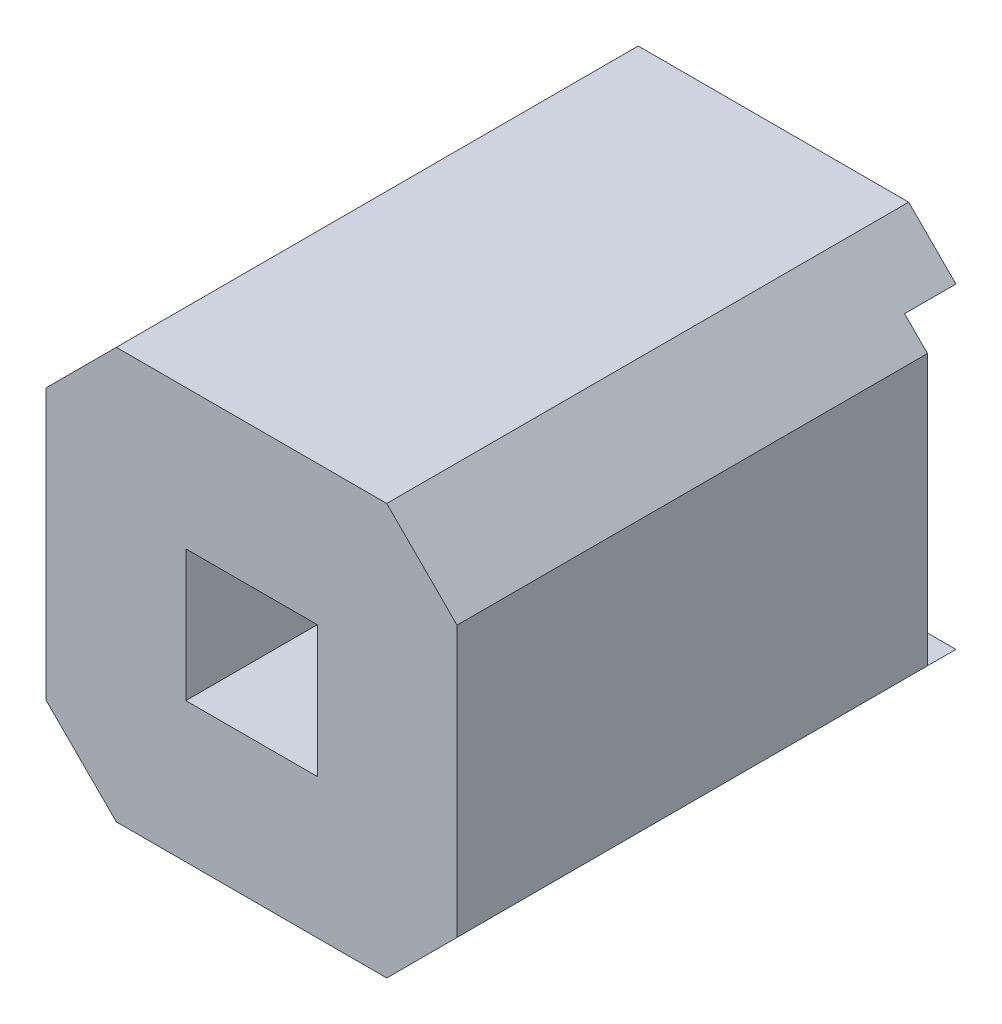
ISO-10303-21;
HEADER;
FILE_DESCRIPTION(('STEP AP214'),'2;1');
FILE_NAME('part.step','',(''),(''),'','','');
FILE_SCHEMA(('AUTOMOTIVE_DESIGN { 1 0 10303 214 1 1 1 1 }'));
ENDSEC;
DATA;
#1=APPLICATION_CONTEXT('core data for automotive mechanical design processes');
#2=APPLICATION_PROTOCOL_DEFINITION('international standard','automotive_design',2000,#1);
#3=PRODUCT_CONTEXT('',#1,'mechanical');
#4=PRODUCT('Part','Part','',(#3));
#5=PRODUCT_RELATED_PRODUCT_CATEGORY('part','',(#4));
#6=PRODUCT_DEFINITION_FORMATION('','',#4);
#7=PRODUCT_DEFINITION_CONTEXT('part definition',#1,'design');
#8=PRODUCT_DEFINITION('design','',#6,#7);
#9=PRODUCT_DEFINITION_SHAPE('','',#8);
#10=(LENGTH_UNIT() NAMED_UNIT(*) SI_UNIT(.MILLI.,.METRE.));
#11=(NAMED_UNIT(*) PLANE_ANGLE_UNIT() SI_UNIT($,.RADIAN.));
#12=(NAMED_UNIT(*) SI_UNIT($,.STERADIAN.) SOLID_ANGLE_UNIT());
#13=UNCERTAINTY_MEASURE_WITH_UNIT(LENGTH_MEASURE(1.E-05),#10,'distance_accuracy_value','');
#14=(GEOMETRIC_REPRESENTATION_CONTEXT(3) GLOBAL_UNCERTAINTY_ASSIGNED_CONTEXT((#13)) GLOBAL_UNIT_ASSIGNED_CONTEXT((#10,
#11,#12)) REPRESENTATION_CONTEXT('',''));
#15=CARTESIAN_POINT('',(0.,0.,0.));
#16=DIRECTION('',(0.,0.,1.));
#17=DIRECTION('',(1.,0.,0.));
#18=AXIS2_PLACEMENT_3D('',#15,#16,#17);
#19=CARTESIAN_POINT('',(41.58,36.22100192089,2.05));
#20=DIRECTION('',(0.,-0.707106781186498,-0.707106781186598));
#21=DIRECTION('',(0.,-0.707106781186598,0.707106781186498));
#22=AXIS2_PLACEMENT_3D('',#19,#20,#21);
#23=PLANE('',#22);
#24=DIRECTION('',(1.,1.19216795888047E-11,0.));
#25=VECTOR('',#24,1.);
#26=CARTESIAN_POINT('',(41.48000000001,36.3210019209,1.95000000001));
#27=LINE('',#26,#25);
#28=CARTESIAN_POINT('',(41.48,36.32100192089,1.95));
#29=VERTEX_POINT('',#28);
#30=CARTESIAN_POINT('',(42.32,36.32100192089,1.95));
#31=VERTEX_POINT('',#30);
#32=EDGE_CURVE('E297',#29,#31,#27,.T.);
#33=ORIENTED_EDGE('',*,*,#32,.T.);
#34=DIRECTION('',(0.577350269189626,0.577350269189626,-0.577350269189626));
#35=VECTOR('',#34,1.);
#36=CARTESIAN_POINT('',(42.22000000001,36.2210019209,2.05000000001));
#37=LINE('',#36,#35);
#38=CARTESIAN_POINT('',(42.22,36.22100192089,2.05));
#39=VERTEX_POINT('',#38);
#40=EDGE_CURVE('E317',#39,#31,#37,.T.);
#41=ORIENTED_EDGE('',*,*,#40,.F.);
#42=DIRECTION('',(-1.,-1.56361022300019E-11,0.));
#43=VECTOR('',#42,1.);
#44=CARTESIAN_POINT('',(42.22000000001,36.2210019209,2.05000000001));
#45=LINE('',#44,#43);
#46=CARTESIAN_POINT('',(41.58,36.22100192089,2.05));
#47=VERTEX_POINT('',#46);
#48=EDGE_CURVE('E343',#39,#47,#45,.T.);
#49=ORIENTED_EDGE('',*,*,#48,.T.);
#50=DIRECTION('',(0.577350269189626,-0.577350269189626,0.577350269189626));
#51=VECTOR('',#50,1.);
#52=CARTESIAN_POINT('',(41.48000000001,36.3210019209,1.95000000001));
#53=LINE('',#52,#51);
#54=EDGE_CURVE('E11',#29,#47,#53,.T.);
#55=ORIENTED_EDGE('',*,*,#54,.F.);
#56=EDGE_LOOP('',(#33,#41,#49,#55));
#57=FACE_BOUND('',#56,.T.);
#58=ADVANCED_FACE('F17',(#57),#23,.T.);
#59=CARTESIAN_POINT('',(41.58,35.58100192089,2.05));
#60=DIRECTION('',(0.707106781186498,0.,-0.707106781186598));
#61=DIRECTION('',(0.,-1.,0.));
#62=AXIS2_PLACEMENT_3D('',#59,#60,#61);
#63=PLANE('',#62);
#64=DIRECTION('',(0.,1.,0.));
#65=VECTOR('',#64,1.);
#66=CARTESIAN_POINT('',(41.48000000001,35.4810019209,1.95000000001));
#67=LINE('',#66,#65);
#68=CARTESIAN_POINT('',(41.48,35.48100192089,1.95));
#69=VERTEX_POINT('',#68);
#70=EDGE_CURVE('E303',#69,#29,#67,.T.);
#71=ORIENTED_EDGE('',*,*,#70,.T.);
#72=ORIENTED_EDGE('',*,*,#54,.T.);
#73=DIRECTION('',(0.,-1.,0.));
#74=VECTOR('',#73,1.);
#75=CARTESIAN_POINT('',(41.58000000001,36.2210019209,2.05000000001));
#76=LINE('',#75,#74);
#77=CARTESIAN_POINT('',(41.58,35.58100192089,2.05));
#78=VERTEX_POINT('',#77);
#79=EDGE_CURVE('E355',#47,#78,#76,.T.);
#80=ORIENTED_EDGE('',*,*,#79,.T.);
#81=DIRECTION('',(0.577350269189626,0.577350269189626,0.577350269189626));
#82=VECTOR('',#81,1.);
#83=CARTESIAN_POINT('',(41.48000000001,35.4810019209,1.95000000001));
#84=LINE('',#83,#82);
#85=EDGE_CURVE('E269',#69,#78,#84,.T.);
#86=ORIENTED_EDGE('',*,*,#85,.F.);
#87=EDGE_LOOP('',(#71,#72,#80,#86));
#88=FACE_BOUND('',#87,.T.);
#89=ADVANCED_FACE('F448',(#88),#63,.T.);
#90=CARTESIAN_POINT('',(40.63,34.90100192089,1.7));
#91=DIRECTION('',(0.,1.,0.));
#92=DIRECTION('',(1.,0.,0.));
#93=AXIS2_PLACEMENT_3D('',#90,#91,#92);
#94=PLANE('',#93);
#95=DIRECTION('',(0.,0.,1.));
#96=VECTOR('',#95,1.);
#97=CARTESIAN_POINT('',(41.24183766185,34.9010019209,1.70000000001));
#98=LINE('',#97,#96);
#99=CARTESIAN_POINT('',(41.24183766184,34.90100192089,1.7));
#100=VERTEX_POINT('',#99);
#101=CARTESIAN_POINT('',(41.24183766184,34.90100192089,4.24));
#102=VERTEX_POINT('',#101);
#103=EDGE_CURVE('E27',#100,#102,#98,.T.);
#104=ORIENTED_EDGE('',*,*,#103,.F.);
#105=DIRECTION('',(1.,0.,0.));
#106=VECTOR('',#105,1.);
#107=CARTESIAN_POINT('',(41.24183766185,34.9010019209,1.70000000001));
#108=LINE('',#107,#106);
#109=CARTESIAN_POINT('',(42.55816233816,34.90100192089,1.7));
#110=VERTEX_POINT('',#109);
#111=EDGE_CURVE('E156',#100,#110,#108,.T.);
#112=ORIENTED_EDGE('',*,*,#111,.T.);
#113=DIRECTION('',(0.,0.,-1.));
#114=VECTOR('',#113,1.);
#115=CARTESIAN_POINT('',(42.55816233817,34.9010019209,4.24000000001));
#116=LINE('',#115,#114);
#117=CARTESIAN_POINT('',(42.55816233816,34.90100192089,4.24));
#118=VERTEX_POINT('',#117);
#119=EDGE_CURVE('E171',#118,#110,#116,.T.);
#120=ORIENTED_EDGE('',*,*,#119,.F.);
#121=DIRECTION('',(-1.,0.,0.));
#122=VECTOR('',#121,1.);
#123=CARTESIAN_POINT('',(42.55816233817,34.9010019209,4.24000000001));
#124=LINE('',#123,#122);
#125=EDGE_CURVE('E244',#118,#102,#124,.T.);
#126=ORIENTED_EDGE('',*,*,#125,.T.);
#127=EDGE_LOOP('',(#104,#112,#120,#126));
#128=FACE_BOUND('',#127,.T.);
#129=ADVANCED_FACE('F454',(#128),#94,.F.);
#130=CARTESIAN_POINT('',(40.82091883092,35.32192075181,1.7));
#131=DIRECTION('',(0.707106781186548,0.707106781186548,0.));
#132=DIRECTION('',(0.,0.,-1.));
#133=AXIS2_PLACEMENT_3D('',#130,#131,#132);
#134=PLANE('',#133);
#135=ORIENTED_EDGE('',*,*,#103,.T.);
#136=DIRECTION('',(0.707106781186498,-0.707106781186598,0.));
#137=VECTOR('',#136,1.);
#138=CARTESIAN_POINT('',(40.90000000001,35.24283958274,4.24000000001));
#139=LINE('',#138,#137);
#140=CARTESIAN_POINT('',(40.9,35.24283958273,4.24));
#141=VERTEX_POINT('',#140);
#142=EDGE_CURVE('E250',#141,#102,#139,.T.);
#143=ORIENTED_EDGE('',*,*,#142,.F.);
#144=DIRECTION('',(0.,0.,-1.));
#145=VECTOR('',#144,1.);
#146=CARTESIAN_POINT('',(40.90000000001,35.24283958274,4.24000000001));
#147=LINE('',#146,#145);
#148=CARTESIAN_POINT('',(40.9,35.24283958273,1.95));
#149=VERTEX_POINT('',#148);
#150=EDGE_CURVE('E432',#141,#149,#147,.T.);
#151=ORIENTED_EDGE('',*,*,#150,.T.);
#152=DIRECTION('',(-0.707106781186398,0.707106781186698,0.));
#153=VECTOR('',#152,1.);
#154=CARTESIAN_POINT('',(41.01183766185,35.1310019209,1.95000000001));
#155=LINE('',#154,#153);
#156=CARTESIAN_POINT('',(41.01183766184,35.13100192089,1.95));
#157=VERTEX_POINT('',#156);
#158=EDGE_CURVE('E293',#157,#149,#155,.T.);
#159=ORIENTED_EDGE('',*,*,#158,.F.);
#160=DIRECTION('',(0.,0.,-1.));
#161=VECTOR('',#160,1.);
#162=CARTESIAN_POINT('',(41.01183766185,35.1310019209,1.95000000001));
#163=LINE('',#162,#161);
#164=CARTESIAN_POINT('',(41.01183766184,35.13100192089,1.7));
#165=VERTEX_POINT('',#164);
#166=EDGE_CURVE('E157',#157,#165,#163,.T.);
#167=ORIENTED_EDGE('',*,*,#166,.T.);
#168=DIRECTION('',(-0.707106781186597,0.707106781186498,0.));
#169=VECTOR('',#168,1.);
#170=CARTESIAN_POINT('',(41.24183766185,34.9010019209,1.70000000001));
#171=LINE('',#170,#169);
#172=EDGE_CURVE('E20',#100,#165,#171,.T.);
#173=ORIENTED_EDGE('',*,*,#172,.F.);
#174=EDGE_LOOP('',(#135,#143,#151,#159,#167,#173));
#175=FACE_BOUND('',#174,.T.);
#176=ADVANCED_FACE('F430',(#175),#134,.F.);
#177=CARTESIAN_POINT('',(40.63,37.17100192089,1.7));
#178=DIRECTION('',(0.,0.,1.));
#179=DIRECTION('',(1.,0.,0.));
#180=AXIS2_PLACEMENT_3D('',#177,#178,#179);
#181=PLANE('',#180);
#182=DIRECTION('',(-0.707106781186597,-0.707106781186498,0.));
#183=VECTOR('',#182,1.);
#184=CARTESIAN_POINT('',(42.78816233817,35.1310019209,1.70000000001));
#185=LINE('',#184,#183);
#186=CARTESIAN_POINT('',(42.78816233816,35.13100192089,1.7));
#187=VERTEX_POINT('',#186);
#188=EDGE_CURVE('E150',#187,#110,#185,.T.);
#189=ORIENTED_EDGE('',*,*,#188,.T.);
#190=ORIENTED_EDGE('',*,*,#111,.F.);
#191=ORIENTED_EDGE('',*,*,#172,.T.);
#192=DIRECTION('',(-1.,0.,0.));
#193=VECTOR('',#192,1.);
#194=CARTESIAN_POINT('',(42.78816233817,35.1310019209,1.70000000001));
#195=LINE('',#194,#193);
#196=EDGE_CURVE('E145',#187,#165,#195,.T.);
#197=ORIENTED_EDGE('',*,*,#196,.F.);
#198=EDGE_LOOP('',(#189,#190,#191,#197));
#199=FACE_BOUND('',#198,.T.);
#200=ADVANCED_FACE('F147',(#199),#181,.F.);
#201=CARTESIAN_POINT('',(40.63,35.13100192089,1.95));
#202=DIRECTION('',(0.,1.,0.));
#203=DIRECTION('',(1.,0.,0.));
#204=AXIS2_PLACEMENT_3D('',#201,#202,#203);
#205=PLANE('',#204);
#206=ORIENTED_EDGE('',*,*,#166,.F.);
#207=DIRECTION('',(-1.,0.,0.));
#208=VECTOR('',#207,1.);
#209=CARTESIAN_POINT('',(42.78816233817,35.1310019209,1.95000000001));
#210=LINE('',#209,#208);
#211=CARTESIAN_POINT('',(42.78816233816,35.13100192089,1.95));
#212=VERTEX_POINT('',#211);
#213=EDGE_CURVE('E163',#212,#157,#210,.T.);
#214=ORIENTED_EDGE('',*,*,#213,.F.);
#215=DIRECTION('',(0.,0.,1.));
#216=VECTOR('',#215,1.);
#217=CARTESIAN_POINT('',(42.78816233817,35.1310019209,1.70000000001));
#218=LINE('',#217,#216);
#219=EDGE_CURVE('E160',#187,#212,#218,.T.);
#220=ORIENTED_EDGE('',*,*,#219,.F.);
#221=ORIENTED_EDGE('',*,*,#196,.T.);
#222=EDGE_LOOP('',(#206,#214,#220,#221));
#223=FACE_BOUND('',#222,.T.);
#224=ADVANCED_FACE('F161',(#223),#205,.T.);
#225=CARTESIAN_POINT('',(42.97908116908,35.32192075181,1.7));
#226=DIRECTION('',(-0.707106781186548,0.707106781186548,0.));
#227=DIRECTION('',(0.,0.,1.));
#228=AXIS2_PLACEMENT_3D('',#225,#226,#227);
#229=PLANE('',#228);
#230=ORIENTED_EDGE('',*,*,#119,.T.);
#231=ORIENTED_EDGE('',*,*,#188,.F.);
#232=ORIENTED_EDGE('',*,*,#219,.T.);
#233=DIRECTION('',(-0.707106781186398,-0.707106781186698,0.));
#234=VECTOR('',#233,1.);
#235=CARTESIAN_POINT('',(42.90000000001,35.24283958274,1.95000000001));
#236=LINE('',#235,#234);
#237=CARTESIAN_POINT('',(42.9,35.24283958273,1.95));
#238=VERTEX_POINT('',#237);
#239=EDGE_CURVE('E228',#238,#212,#236,.T.);
#240=ORIENTED_EDGE('',*,*,#239,.F.);
#241=DIRECTION('',(0.,0.,1.));
#242=VECTOR('',#241,1.);
#243=CARTESIAN_POINT('',(42.90000000001,35.24283958274,1.95000000001));
#244=LINE('',#243,#242);
#245=CARTESIAN_POINT('',(42.9,35.24283958273,4.24));
#246=VERTEX_POINT('',#245);
#247=EDGE_CURVE('E178',#238,#246,#244,.T.);
#248=ORIENTED_EDGE('',*,*,#247,.T.);
#249=DIRECTION('',(0.707106781186498,0.707106781186598,0.));
#250=VECTOR('',#249,1.);
#251=CARTESIAN_POINT('',(42.55816233817,34.9010019209,4.24000000001));
#252=LINE('',#251,#250);
#253=EDGE_CURVE('E226',#118,#246,#252,.T.);
#254=ORIENTED_EDGE('',*,*,#253,.F.);
#255=EDGE_LOOP('',(#230,#231,#232,#240,#248,#254));
#256=FACE_BOUND('',#255,.T.);
#257=ADVANCED_FACE('F169',(#256),#229,.F.);
#258=CARTESIAN_POINT('',(42.9,37.17100192089,1.7));
#259=DIRECTION('',(-1.,0.,0.));
#260=DIRECTION('',(0.,0.,1.));
#261=AXIS2_PLACEMENT_3D('',#258,#259,#260);
#262=PLANE('',#261);
#263=DIRECTION('',(0.,0.,-1.));
#264=VECTOR('',#263,1.);
#265=CARTESIAN_POINT('',(42.90000000001,36.55916425906,4.24000000001));
#266=LINE('',#265,#264);
#267=CARTESIAN_POINT('',(42.9,36.55916425905,4.24));
#268=VERTEX_POINT('',#267);
#269=CARTESIAN_POINT('',(42.9,36.55916425905,1.95));
#270=VERTEX_POINT('',#269);
#271=EDGE_CURVE('E216',#268,#270,#266,.T.);
#272=ORIENTED_EDGE('',*,*,#271,.F.);
#273=DIRECTION('',(0.,1.,0.));
#274=VECTOR('',#273,1.);
#275=CARTESIAN_POINT('',(42.90000000001,35.24283958274,4.24000000001));
#276=LINE('',#275,#274);
#277=EDGE_CURVE('E233',#246,#268,#276,.T.);
#278=ORIENTED_EDGE('',*,*,#277,.F.);
#279=ORIENTED_EDGE('',*,*,#247,.F.);
#280=DIRECTION('',(0.,-1.,0.));
#281=VECTOR('',#280,1.);
#282=CARTESIAN_POINT('',(42.90000000001,36.55916425906,1.95000000001));
#283=LINE('',#282,#281);
#284=EDGE_CURVE('E288',#270,#238,#283,.T.);
#285=ORIENTED_EDGE('',*,*,#284,.F.);
#286=EDGE_LOOP('',(#272,#278,#279,#285));
#287=FACE_BOUND('',#286,.T.);
#288=ADVANCED_FACE('F234',(#287),#262,.F.);
#289=CARTESIAN_POINT('',(41.32091883092,36.98008308997,1.7));
#290=DIRECTION('',(-0.707106781186548,0.707106781186548,0.));
#291=DIRECTION('',(0.,0.,1.));
#292=AXIS2_PLACEMENT_3D('',#289,#290,#291);
#293=PLANE('',#292);
#294=DIRECTION('',(0.,0.,1.));
#295=VECTOR('',#294,1.);
#296=CARTESIAN_POINT('',(41.01183766185,36.6710019209,1.70000000001));
#297=LINE('',#296,#295);
#298=CARTESIAN_POINT('',(41.01183766184,36.67100192089,1.7));
#299=VERTEX_POINT('',#298);
#300=CARTESIAN_POINT('',(41.01183766184,36.67100192089,1.95));
#301=VERTEX_POINT('',#300);
#302=EDGE_CURVE('E217',#299,#301,#297,.T.);
#303=ORIENTED_EDGE('',*,*,#302,.T.);
#304=DIRECTION('',(0.707106781186498,0.707106781186597,0.));
#305=VECTOR('',#304,1.);
#306=CARTESIAN_POINT('',(40.90000000001,36.55916425906,1.95000000001));
#307=LINE('',#306,#305);
#308=CARTESIAN_POINT('',(40.9,36.55916425905,1.95));
#309=VERTEX_POINT('',#308);
#310=EDGE_CURVE('E264',#309,#301,#307,.T.);
#311=ORIENTED_EDGE('',*,*,#310,.F.);
#312=DIRECTION('',(0.,0.,1.));
#313=VECTOR('',#312,1.);
#314=CARTESIAN_POINT('',(40.90000000001,36.55916425906,1.95000000001));
#315=LINE('',#314,#313);
#316=CARTESIAN_POINT('',(40.9,36.55916425905,4.24));
#317=VERTEX_POINT('',#316);
#318=EDGE_CURVE('E256',#309,#317,#315,.T.);
#319=ORIENTED_EDGE('',*,*,#318,.T.);
#320=DIRECTION('',(-0.707106781186498,-0.707106781186598,0.));
#321=VECTOR('',#320,1.);
#322=CARTESIAN_POINT('',(41.24183766185,36.9010019209,4.24000000001));
#323=LINE('',#322,#321);
#324=CARTESIAN_POINT('',(41.24183766184,36.90100192089,4.24));
#325=VERTEX_POINT('',#324);
#326=EDGE_CURVE('E361',#325,#317,#323,.T.);
#327=ORIENTED_EDGE('',*,*,#326,.F.);
#328=DIRECTION('',(0.,0.,-1.));
#329=VECTOR('',#328,1.);
#330=CARTESIAN_POINT('',(41.24183766185,36.9010019209,4.24000000001));
#331=LINE('',#330,#329);
#332=CARTESIAN_POINT('',(41.24183766184,36.90100192089,1.7));
#333=VERTEX_POINT('',#332);
#334=EDGE_CURVE('E196',#325,#333,#331,.T.);
#335=ORIENTED_EDGE('',*,*,#334,.T.);
#336=DIRECTION('',(0.707106781186498,0.707106781186597,0.));
#337=VECTOR('',#336,1.);
#338=CARTESIAN_POINT('',(41.01183766185,36.6710019209,1.70000000001));
#339=LINE('',#338,#337);
#340=EDGE_CURVE('E209',#299,#333,#339,.T.);
#341=ORIENTED_EDGE('',*,*,#340,.F.);
#342=EDGE_LOOP('',(#303,#311,#319,#327,#335,#341));
#343=FACE_BOUND('',#342,.T.);
#344=ADVANCED_FACE('F382',(#343),#293,.T.);
#345=CARTESIAN_POINT('',(40.63,36.67100192089,1.95));
#346=DIRECTION('',(0.,1.,0.));
#347=DIRECTION('',(1.,0.,0.));
#348=AXIS2_PLACEMENT_3D('',#345,#346,#347);
#349=PLANE('',#348);
#350=DIRECTION('',(0.,0.,-1.));
#351=VECTOR('',#350,1.);
#352=CARTESIAN_POINT('',(42.78816233817,36.6710019209,1.95000000001));
#353=LINE('',#352,#351);
#354=CARTESIAN_POINT('',(42.78816233816,36.67100192089,1.95));
#355=VERTEX_POINT('',#354);
#356=CARTESIAN_POINT('',(42.78816233816,36.67100192089,1.7));
#357=VERTEX_POINT('',#356);
#358=EDGE_CURVE('E220',#355,#357,#353,.T.);
#359=ORIENTED_EDGE('',*,*,#358,.F.);
#360=DIRECTION('',(-1.,0.,0.));
#361=VECTOR('',#360,1.);
#362=CARTESIAN_POINT('',(42.78816233817,36.6710019209,1.95000000001));
#363=LINE('',#362,#361);
#364=EDGE_CURVE('E268',#355,#301,#363,.T.);
#365=ORIENTED_EDGE('',*,*,#364,.T.);
#366=ORIENTED_EDGE('',*,*,#302,.F.);
#367=DIRECTION('',(-1.,0.,0.));
#368=VECTOR('',#367,1.);
#369=CARTESIAN_POINT('',(42.78816233817,36.6710019209,1.70000000001));
#370=LINE('',#369,#368);
#371=EDGE_CURVE('E205',#357,#299,#370,.T.);
#372=ORIENTED_EDGE('',*,*,#371,.F.);
#373=EDGE_LOOP('',(#359,#365,#366,#372));
#374=FACE_BOUND('',#373,.T.);
#375=ADVANCED_FACE('F392',(#374),#349,.F.);
#376=CARTESIAN_POINT('',(42.47908116908,36.98008308997,1.7));
#377=DIRECTION('',(0.707106781186548,0.707106781186548,0.));
#378=DIRECTION('',(0.,0.,-1.));
#379=AXIS2_PLACEMENT_3D('',#376,#377,#378);
#380=PLANE('',#379);
#381=ORIENTED_EDGE('',*,*,#271,.T.);
#382=DIRECTION('',(0.707106781186548,-0.707106781186548,0.));
#383=VECTOR('',#382,1.);
#384=CARTESIAN_POINT('',(42.78816233817,36.6710019209,1.95000000001));
#385=LINE('',#384,#383);
#386=EDGE_CURVE('E278',#355,#270,#385,.T.);
#387=ORIENTED_EDGE('',*,*,#386,.F.);
#388=ORIENTED_EDGE('',*,*,#358,.T.);
#389=DIRECTION('',(0.707106781186597,-0.707106781186498,0.));
#390=VECTOR('',#389,1.);
#391=CARTESIAN_POINT('',(42.55816233817,36.9010019209,1.70000000001));
#392=LINE('',#391,#390);
#393=CARTESIAN_POINT('',(42.55816233816,36.90100192089,1.7));
#394=VERTEX_POINT('',#393);
#395=EDGE_CURVE('E212',#394,#357,#392,.T.);
#396=ORIENTED_EDGE('',*,*,#395,.F.);
#397=DIRECTION('',(0.,0.,1.));
#398=VECTOR('',#397,1.);
#399=CARTESIAN_POINT('',(42.55816233817,36.9010019209,1.70000000001));
#400=LINE('',#399,#398);
#401=CARTESIAN_POINT('',(42.55816233816,36.90100192089,4.24));
#402=VERTEX_POINT('',#401);
#403=EDGE_CURVE('E198',#394,#402,#400,.T.);
#404=ORIENTED_EDGE('',*,*,#403,.T.);
#405=DIRECTION('',(-0.707106781186498,0.707106781186598,0.));
#406=VECTOR('',#405,1.);
#407=CARTESIAN_POINT('',(42.90000000001,36.55916425906,4.24000000001));
#408=LINE('',#407,#406);
#409=EDGE_CURVE('E239',#268,#402,#408,.T.);
#410=ORIENTED_EDGE('',*,*,#409,.F.);
#411=EDGE_LOOP('',(#381,#387,#388,#396,#404,#410));
#412=FACE_BOUND('',#411,.T.);
#413=ADVANCED_FACE('F436',(#412),#380,.T.);
#414=CARTESIAN_POINT('',(40.63,37.17100192089,1.7));
#415=DIRECTION('',(0.,0.,1.));
#416=DIRECTION('',(1.,0.,0.));
#417=AXIS2_PLACEMENT_3D('',#414,#415,#416);
#418=PLANE('',#417);
#419=ORIENTED_EDGE('',*,*,#371,.T.);
#420=ORIENTED_EDGE('',*,*,#340,.T.);
#421=DIRECTION('',(1.,0.,0.));
#422=VECTOR('',#421,1.);
#423=CARTESIAN_POINT('',(41.24183766185,36.9010019209,1.70000000001));
#424=LINE('',#423,#422);
#425=EDGE_CURVE('E201',#333,#394,#424,.T.);
#426=ORIENTED_EDGE('',*,*,#425,.T.);
#427=ORIENTED_EDGE('',*,*,#395,.T.);
#428=EDGE_LOOP('',(#419,#420,#426,#427));
#429=FACE_BOUND('',#428,.T.);
#430=ADVANCED_FACE('F388',(#429),#418,.F.);
#431=CARTESIAN_POINT('',(40.63,36.90100192089,1.7));
#432=DIRECTION('',(0.,1.,0.));
#433=DIRECTION('',(1.,0.,0.));
#434=AXIS2_PLACEMENT_3D('',#431,#432,#433);
#435=PLANE('',#434);
#436=ORIENTED_EDGE('',*,*,#334,.F.);
#437=DIRECTION('',(-1.,0.,0.));
#438=VECTOR('',#437,1.);
#439=CARTESIAN_POINT('',(42.55816233817,36.9010019209,4.24000000001));
#440=LINE('',#439,#438);
#441=EDGE_CURVE('E369',#402,#325,#440,.T.);
#442=ORIENTED_EDGE('',*,*,#441,.F.);
#443=ORIENTED_EDGE('',*,*,#403,.F.);
#444=ORIENTED_EDGE('',*,*,#425,.F.);
#445=EDGE_LOOP('',(#436,#442,#443,#444));
#446=FACE_BOUND('',#445,.T.);
#447=ADVANCED_FACE('F385',(#446),#435,.T.);
#448=CARTESIAN_POINT('',(40.63,37.17100192089,4.24));
#449=DIRECTION('',(0.,0.,-1.));
#450=DIRECTION('',(0.,-1.,0.));
#451=AXIS2_PLACEMENT_3D('',#448,#449,#450);
#452=PLANE('',#451);
#453=DIRECTION('',(0.,1.,0.));
#454=VECTOR('',#453,1.);
#455=CARTESIAN_POINT('',(42.22000000001,35.5810019209,4.24000000001));
#456=LINE('',#455,#454);
#457=CARTESIAN_POINT('',(42.22,35.58100192089,4.24));
#458=VERTEX_POINT('',#457);
#459=CARTESIAN_POINT('',(42.22,36.22100192089,4.24));
#460=VERTEX_POINT('',#459);
#461=EDGE_CURVE('E335',#458,#460,#456,.T.);
#462=ORIENTED_EDGE('',*,*,#461,.F.);
#463=DIRECTION('',(1.,0.,0.));
#464=VECTOR('',#463,1.);
#465=CARTESIAN_POINT('',(41.58000000001,35.5810019209,4.24000000001));
#466=LINE('',#465,#464);
#467=CARTESIAN_POINT('',(41.58,35.58100192089,4.24));
#468=VERTEX_POINT('',#467);
#469=EDGE_CURVE('E330',#468,#458,#466,.T.);
#470=ORIENTED_EDGE('',*,*,#469,.F.);
#471=DIRECTION('',(0.,-1.,0.));
#472=VECTOR('',#471,1.);
#473=CARTESIAN_POINT('',(41.58000000001,36.2210019209,4.24000000001));
#474=LINE('',#473,#472);
#475=CARTESIAN_POINT('',(41.58,36.22100192089,4.24));
#476=VERTEX_POINT('',#475);
#477=EDGE_CURVE('E358',#476,#468,#474,.T.);
#478=ORIENTED_EDGE('',*,*,#477,.F.);
#479=DIRECTION('',(-1.,0.,0.));
#480=VECTOR('',#479,1.);
#481=CARTESIAN_POINT('',(42.22000000001,36.2210019209,4.24000000001));
#482=LINE('',#481,#480);
#483=EDGE_CURVE('E347',#460,#476,#482,.T.);
#484=ORIENTED_EDGE('',*,*,#483,.F.);
#485=EDGE_LOOP('',(#462,#470,#478,#484));
#486=FACE_BOUND('',#485,.T.);
#487=ORIENTED_EDGE('',*,*,#326,.T.);
#488=DIRECTION('',(0.,1.,0.));
#489=VECTOR('',#488,1.);
#490=CARTESIAN_POINT('',(40.90000000001,35.24283958274,4.24000000001));
#491=LINE('',#490,#489);
#492=EDGE_CURVE('E254',#141,#317,#491,.T.);
#493=ORIENTED_EDGE('',*,*,#492,.F.);
#494=ORIENTED_EDGE('',*,*,#142,.T.);
#495=ORIENTED_EDGE('',*,*,#125,.F.);
#496=ORIENTED_EDGE('',*,*,#253,.T.);
#497=ORIENTED_EDGE('',*,*,#277,.T.);
#498=ORIENTED_EDGE('',*,*,#409,.T.);
#499=ORIENTED_EDGE('',*,*,#441,.T.);
#500=EDGE_LOOP('',(#487,#493,#494,#495,#496,#497,#498,#499));
#501=FACE_BOUND('',#500,.T.);
#502=ADVANCED_FACE('F242',(#486,#501),#452,.F.);
#503=CARTESIAN_POINT('',(41.58,35.58100192089,4.95));
#504=DIRECTION('',(-1.,0.,0.));
#505=DIRECTION('',(0.,0.,1.));
#506=AXIS2_PLACEMENT_3D('',#503,#504,#505);
#507=PLANE('',#506);
#508=ORIENTED_EDGE('',*,*,#79,.F.);
#509=DIRECTION('',(0.,0.,1.));
#510=VECTOR('',#509,1.);
#511=CARTESIAN_POINT('',(41.58000000001,36.2210019209,2.05000000001));
#512=LINE('',#511,#510);
#513=EDGE_CURVE('E351',#47,#476,#512,.T.);
#514=ORIENTED_EDGE('',*,*,#513,.T.);
#515=ORIENTED_EDGE('',*,*,#477,.T.);
#516=DIRECTION('',(0.,0.,1.));
#517=VECTOR('',#516,1.);
#518=CARTESIAN_POINT('',(41.58000000001,35.5810019209,2.05000000001));
#519=LINE('',#518,#517);
#520=EDGE_CURVE('E326',#78,#468,#519,.T.);
#521=ORIENTED_EDGE('',*,*,#520,.F.);
#522=EDGE_LOOP('',(#508,#514,#515,#521));
#523=FACE_BOUND('',#522,.T.);
#524=ADVANCED_FACE('F473',(#523),#507,.F.);
#525=CARTESIAN_POINT('',(41.58,36.22100192089,4.95));
#526=DIRECTION('',(0.,1.,0.));
#527=DIRECTION('',(1.,0.,0.));
#528=AXIS2_PLACEMENT_3D('',#525,#526,#527);
#529=PLANE('',#528);
#530=ORIENTED_EDGE('',*,*,#48,.F.);
#531=DIRECTION('',(0.,0.,1.));
#532=VECTOR('',#531,1.);
#533=CARTESIAN_POINT('',(42.22000000001,36.2210019209,2.05000000001));
#534=LINE('',#533,#532);
#535=EDGE_CURVE('E338',#39,#460,#534,.T.);
#536=ORIENTED_EDGE('',*,*,#535,.T.);
#537=ORIENTED_EDGE('',*,*,#483,.T.);
#538=ORIENTED_EDGE('',*,*,#513,.F.);
#539=EDGE_LOOP('',(#530,#536,#537,#538));
#540=FACE_BOUND('',#539,.T.);
#541=ADVANCED_FACE('F469',(#540),#529,.F.);
#542=CARTESIAN_POINT('',(42.22,35.58100192089,4.95));
#543=DIRECTION('',(1.,0.,0.));
#544=DIRECTION('',(0.,1.,0.));
#545=AXIS2_PLACEMENT_3D('',#542,#543,#544);
#546=PLANE('',#545);
#547=DIRECTION('',(1.56361022300019E-11,1.,0.));
#548=VECTOR('',#547,1.);
#549=CARTESIAN_POINT('',(42.22000000001,35.5810019209,2.05000000001));
#550=LINE('',#549,#548);
#551=CARTESIAN_POINT('',(42.22,35.58100192089,2.05));
#552=VERTEX_POINT('',#551);
#553=EDGE_CURVE('E283',#552,#39,#550,.T.);
#554=ORIENTED_EDGE('',*,*,#553,.F.);
#555=DIRECTION('',(0.,0.,1.));
#556=VECTOR('',#555,1.);
#557=CARTESIAN_POINT('',(42.22000000001,35.5810019209,2.05000000001));
#558=LINE('',#557,#556);
#559=EDGE_CURVE('E334',#552,#458,#558,.T.);
#560=ORIENTED_EDGE('',*,*,#559,.T.);
#561=ORIENTED_EDGE('',*,*,#461,.T.);
#562=ORIENTED_EDGE('',*,*,#535,.F.);
#563=EDGE_LOOP('',(#554,#560,#561,#562));
#564=FACE_BOUND('',#563,.T.);
#565=ADVANCED_FACE('F467',(#564),#546,.F.);
#566=CARTESIAN_POINT('',(41.58,35.58100192089,4.95));
#567=DIRECTION('',(0.,-1.,0.));
#568=DIRECTION('',(0.,0.,-1.));
#569=AXIS2_PLACEMENT_3D('',#566,#567,#568);
#570=PLANE('',#569);
#571=DIRECTION('',(1.,0.,0.));
#572=VECTOR('',#571,1.);
#573=CARTESIAN_POINT('',(41.58000000001,35.5810019209,2.05000000001));
#574=LINE('',#573,#572);
#575=EDGE_CURVE('E273',#78,#552,#574,.T.);
#576=ORIENTED_EDGE('',*,*,#575,.F.);
#577=ORIENTED_EDGE('',*,*,#520,.T.);
#578=ORIENTED_EDGE('',*,*,#469,.T.);
#579=ORIENTED_EDGE('',*,*,#559,.F.);
#580=EDGE_LOOP('',(#576,#577,#578,#579));
#581=FACE_BOUND('',#580,.T.);
#582=ADVANCED_FACE('F478',(#581),#570,.F.);
#583=CARTESIAN_POINT('',(41.58,35.58100192089,2.05));
#584=DIRECTION('',(0.,0.707106781186498,-0.707106781186598));
#585=DIRECTION('',(-1.,0.,0.));
#586=AXIS2_PLACEMENT_3D('',#583,#584,#585);
#587=PLANE('',#586);
#588=DIRECTION('',(-1.,0.,0.));
#589=VECTOR('',#588,1.);
#590=CARTESIAN_POINT('',(42.32000000001,35.4810019209,1.95000000001));
#591=LINE('',#590,#589);
#592=CARTESIAN_POINT('',(42.32,35.48100192089,1.95));
#593=VERTEX_POINT('',#592);
#594=EDGE_CURVE('E284',#593,#69,#591,.T.);
#595=ORIENTED_EDGE('',*,*,#594,.T.);
#596=ORIENTED_EDGE('',*,*,#85,.T.);
#597=ORIENTED_EDGE('',*,*,#575,.T.);
#598=DIRECTION('',(0.577350269189626,-0.577350269189626,-0.577350269189626));
#599=VECTOR('',#598,1.);
#600=CARTESIAN_POINT('',(42.22000000001,35.5810019209,2.05000000001));
#601=LINE('',#600,#599);
#602=EDGE_CURVE('E274',#552,#593,#601,.T.);
#603=ORIENTED_EDGE('',*,*,#602,.T.);
#604=EDGE_LOOP('',(#595,#596,#597,#603));
#605=FACE_BOUND('',#604,.T.);
#606=ADVANCED_FACE('F479',(#605),#587,.T.);
#607=CARTESIAN_POINT('',(42.22,35.58100192089,2.05));
#608=DIRECTION('',(-0.707106781186498,0.,-0.707106781186598));
#609=DIRECTION('',(-0.707106781186598,0.,0.707106781186498));
#610=AXIS2_PLACEMENT_3D('',#607,#608,#609);
#611=PLANE('',#610);
#612=ORIENTED_EDGE('',*,*,#553,.T.);
#613=ORIENTED_EDGE('',*,*,#40,.T.);
#614=DIRECTION('',(-1.19216795888047E-11,-1.,0.));
#615=VECTOR('',#614,1.);
#616=CARTESIAN_POINT('',(42.32000000001,36.3210019209,1.95000000001));
#617=LINE('',#616,#615);
#618=EDGE_CURVE('E279',#31,#593,#617,.T.);
#619=ORIENTED_EDGE('',*,*,#618,.T.);
#620=ORIENTED_EDGE('',*,*,#602,.F.);
#621=EDGE_LOOP('',(#612,#613,#619,#620));
#622=FACE_BOUND('',#621,.T.);
#623=ADVANCED_FACE('F462',(#622),#611,.T.);
#624=CARTESIAN_POINT('',(40.63,34.63100192089,1.95));
#625=DIRECTION('',(0.,0.,-1.));
#626=DIRECTION('',(0.,-1.,0.));
#627=AXIS2_PLACEMENT_3D('',#624,#625,#626);
#628=PLANE('',#627);
#629=ORIENTED_EDGE('',*,*,#32,.F.);
#630=ORIENTED_EDGE('',*,*,#70,.F.);
#631=ORIENTED_EDGE('',*,*,#594,.F.);
#632=ORIENTED_EDGE('',*,*,#618,.F.);
#633=EDGE_LOOP('',(#629,#630,#631,#632));
#634=FACE_BOUND('',#633,.T.);
#635=ORIENTED_EDGE('',*,*,#310,.T.);
#636=ORIENTED_EDGE('',*,*,#364,.F.);
#637=ORIENTED_EDGE('',*,*,#386,.T.);
#638=ORIENTED_EDGE('',*,*,#284,.T.);
#639=ORIENTED_EDGE('',*,*,#239,.T.);
#640=ORIENTED_EDGE('',*,*,#213,.T.);
#641=ORIENTED_EDGE('',*,*,#158,.T.);
#642=DIRECTION('',(0.,-1.,0.));
#643=VECTOR('',#642,1.);
#644=CARTESIAN_POINT('',(40.90000000001,36.55916425906,1.95000000001));
#645=LINE('',#644,#643);
#646=EDGE_CURVE('E260',#309,#149,#645,.T.);
#647=ORIENTED_EDGE('',*,*,#646,.F.);
#648=EDGE_LOOP('',(#635,#636,#637,#638,#639,#640,#641,#647));
#649=FACE_BOUND('',#648,.T.);
#650=ADVANCED_FACE('F434',(#634,#649),#628,.T.);
#651=CARTESIAN_POINT('',(40.9,37.17100192089,1.7));
#652=DIRECTION('',(1.,0.,0.));
#653=DIRECTION('',(0.,1.,0.));
#654=AXIS2_PLACEMENT_3D('',#651,#652,#653);
#655=PLANE('',#654);
#656=ORIENTED_EDGE('',*,*,#150,.F.);
#657=ORIENTED_EDGE('',*,*,#492,.T.);
#658=ORIENTED_EDGE('',*,*,#318,.F.);
#659=ORIENTED_EDGE('',*,*,#646,.T.);
#660=EDGE_LOOP('',(#656,#657,#658,#659));
#661=FACE_BOUND('',#660,.T.);
#662=ADVANCED_FACE('F637',(#661),#655,.F.);
#663=CLOSED_SHELL('',(#58,#89,#129,#176,#200,#224,#257,#288,#344,#375,#413,#430,#447,#502,#524,
#541,#565,#582,#606,#623,#650,#662));
#664=MANIFOLD_SOLID_BREP('B1',#663);
#665=ADVANCED_BREP_SHAPE_REPRESENTATION('',(#18,#664),#14);
#666=SHAPE_DEFINITION_REPRESENTATION(#9,#665);
ENDSEC;
END-ISO-10303-21;
